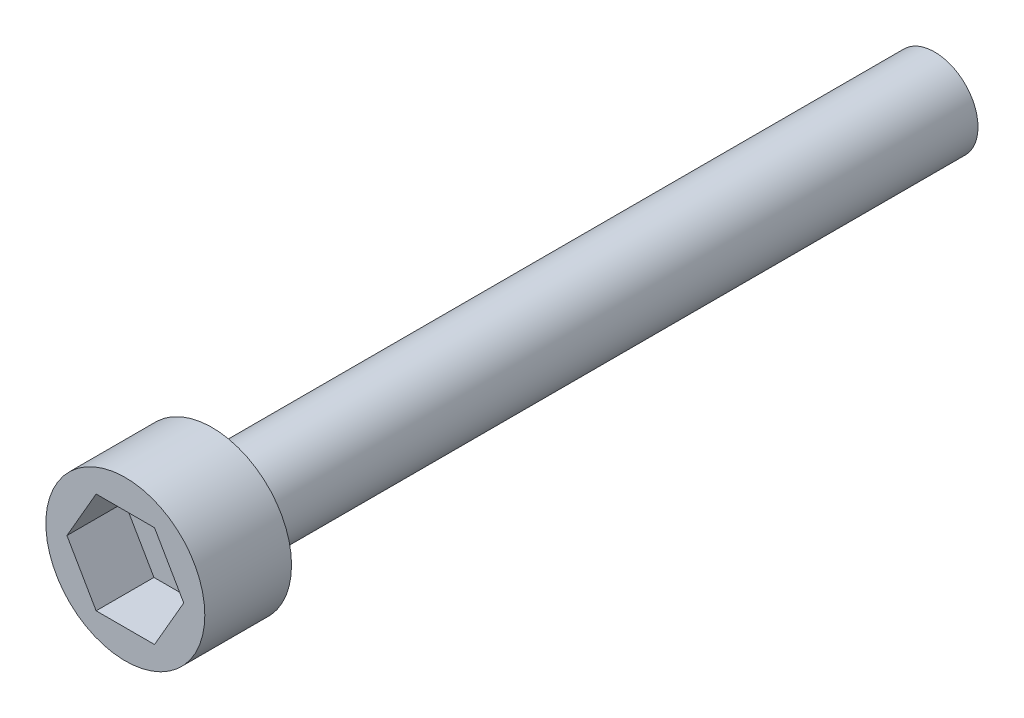
ISO-10303-21;
HEADER;
FILE_DESCRIPTION(('STEP AP214'),'2;1');
FILE_NAME('part.step','',(''),(''),'','','');
FILE_SCHEMA(('AUTOMOTIVE_DESIGN { 1 0 10303 214 1 1 1 1 }'));
ENDSEC;
DATA;
#1=APPLICATION_CONTEXT('core data for automotive mechanical design processes');
#2=APPLICATION_PROTOCOL_DEFINITION('international standard','automotive_design',2000,#1);
#3=PRODUCT_CONTEXT('',#1,'mechanical');
#4=PRODUCT('Part','Part','',(#3));
#5=PRODUCT_RELATED_PRODUCT_CATEGORY('part','',(#4));
#6=PRODUCT_DEFINITION_FORMATION('','',#4);
#7=PRODUCT_DEFINITION_CONTEXT('part definition',#1,'design');
#8=PRODUCT_DEFINITION('design','',#6,#7);
#9=PRODUCT_DEFINITION_SHAPE('','',#8);
#10=(LENGTH_UNIT() NAMED_UNIT(*) SI_UNIT(.MILLI.,.METRE.));
#11=(NAMED_UNIT(*) PLANE_ANGLE_UNIT() SI_UNIT($,.RADIAN.));
#12=(NAMED_UNIT(*) SI_UNIT($,.STERADIAN.) SOLID_ANGLE_UNIT());
#13=UNCERTAINTY_MEASURE_WITH_UNIT(LENGTH_MEASURE(1.E-05),#10,'distance_accuracy_value','');
#14=(GEOMETRIC_REPRESENTATION_CONTEXT(3) GLOBAL_UNCERTAINTY_ASSIGNED_CONTEXT((#13)) GLOBAL_UNIT_ASSIGNED_CONTEXT((#10,
#11,#12)) REPRESENTATION_CONTEXT('',''));
#15=CARTESIAN_POINT('',(0.,0.,0.));
#16=DIRECTION('',(0.,0.,1.));
#17=DIRECTION('',(1.,0.,0.));
#18=AXIS2_PLACEMENT_3D('',#15,#16,#17);
#19=CARTESIAN_POINT('',(0.,0.,25.));
#20=DIRECTION('',(0.,0.,-1.));
#21=DIRECTION('',(-1.,0.,0.));
#22=AXIS2_PLACEMENT_3D('',#19,#20,#21);
#23=CYLINDRICAL_SURFACE('',#22,1.5);
#24=CARTESIAN_POINT('',(0.,0.,25.));
#25=DIRECTION('',(0.,0.,1.));
#26=DIRECTION('',(1.,0.,0.));
#27=AXIS2_PLACEMENT_3D('',#24,#25,#26);
#28=CIRCLE('',#27,1.5);
#29=CARTESIAN_POINT('',(1.5,0.,25.));
#30=VERTEX_POINT('',#29);
#31=EDGE_CURVE('E11',#30,#30,#28,.T.);
#32=ORIENTED_EDGE('',*,*,#31,.F.);
#33=EDGE_LOOP('',(#32));
#34=FACE_BOUND('',#33,.T.);
#35=CARTESIAN_POINT('',(0.,0.,0.));
#36=DIRECTION('',(0.,0.,1.));
#37=DIRECTION('',(1.,0.,0.));
#38=AXIS2_PLACEMENT_3D('',#35,#36,#37);
#39=CIRCLE('',#38,1.5);
#40=CARTESIAN_POINT('',(1.5,0.,0.));
#41=VERTEX_POINT('',#40);
#42=EDGE_CURVE('E39',#41,#41,#39,.T.);
#43=ORIENTED_EDGE('',*,*,#42,.T.);
#44=EDGE_LOOP('',(#43));
#45=FACE_BOUND('',#44,.T.);
#46=ADVANCED_FACE('F36',(#34,#45),#23,.T.);
#47=CARTESIAN_POINT('',(0.,0.,0.));
#48=DIRECTION('',(0.,0.,1.));
#49=DIRECTION('',(1.,0.,0.));
#50=AXIS2_PLACEMENT_3D('',#47,#48,#49);
#51=PLANE('',#50);
#52=ORIENTED_EDGE('',*,*,#42,.F.);
#53=EDGE_LOOP('',(#52));
#54=FACE_BOUND('',#53,.T.);
#55=ADVANCED_FACE('F167',(#54),#51,.F.);
#56=CARTESIAN_POINT('',(0.,0.,28.));
#57=DIRECTION('',(0.,0.,-1.));
#58=DIRECTION('',(-1.,0.,0.));
#59=AXIS2_PLACEMENT_3D('',#56,#57,#58);
#60=CYLINDRICAL_SURFACE('',#59,2.75);
#61=CARTESIAN_POINT('',(0.,0.,28.));
#62=DIRECTION('',(0.,0.,1.));
#63=DIRECTION('',(1.,0.,0.));
#64=AXIS2_PLACEMENT_3D('',#61,#62,#63);
#65=CIRCLE('',#64,2.75);
#66=CARTESIAN_POINT('',(2.75,0.,28.));
#67=VERTEX_POINT('',#66);
#68=EDGE_CURVE('E143',#67,#67,#65,.T.);
#69=ORIENTED_EDGE('',*,*,#68,.F.);
#70=EDGE_LOOP('',(#69));
#71=FACE_BOUND('',#70,.T.);
#72=CARTESIAN_POINT('',(0.,0.,25.));
#73=DIRECTION('',(0.,0.,1.));
#74=DIRECTION('',(1.,0.,0.));
#75=AXIS2_PLACEMENT_3D('',#72,#73,#74);
#76=CIRCLE('',#75,2.75);
#77=CARTESIAN_POINT('',(2.75,0.,25.));
#78=VERTEX_POINT('',#77);
#79=EDGE_CURVE('E137',#78,#78,#76,.T.);
#80=ORIENTED_EDGE('',*,*,#79,.T.);
#81=EDGE_LOOP('',(#80));
#82=FACE_BOUND('',#81,.T.);
#83=ADVANCED_FACE('F149',(#71,#82),#60,.T.);
#84=CARTESIAN_POINT('',(0.,0.,28.));
#85=DIRECTION('',(0.,0.,1.));
#86=DIRECTION('',(1.,0.,0.));
#87=AXIS2_PLACEMENT_3D('',#84,#85,#86);
#88=PLANE('',#87);
#89=DIRECTION('',(0.5,0.866025403784439,0.));
#90=VECTOR('',#89,1.);
#91=CARTESIAN_POINT('',(1.01036297108185,-1.75,28.));
#92=LINE('',#91,#90);
#93=CARTESIAN_POINT('',(1.01036297108185,-1.75,28.));
#94=VERTEX_POINT('',#93);
#95=CARTESIAN_POINT('',(2.02072594216369,0.,28.));
#96=VERTEX_POINT('',#95);
#97=EDGE_CURVE('E50',#94,#96,#92,.T.);
#98=ORIENTED_EDGE('',*,*,#97,.F.);
#99=DIRECTION('',(1.,0.,0.));
#100=VECTOR('',#99,1.);
#101=CARTESIAN_POINT('',(-1.01036297108185,-1.75,28.));
#102=LINE('',#101,#100);
#103=CARTESIAN_POINT('',(-1.01036297108185,-1.75,28.));
#104=VERTEX_POINT('',#103);
#105=EDGE_CURVE('E133',#104,#94,#102,.T.);
#106=ORIENTED_EDGE('',*,*,#105,.F.);
#107=DIRECTION('',(0.5,-0.866025403784439,0.));
#108=VECTOR('',#107,1.);
#109=CARTESIAN_POINT('',(-2.02072594216369,0.,28.));
#110=LINE('',#109,#108);
#111=CARTESIAN_POINT('',(-2.02072594216369,0.,28.));
#112=VERTEX_POINT('',#111);
#113=EDGE_CURVE('E131',#112,#104,#110,.T.);
#114=ORIENTED_EDGE('',*,*,#113,.F.);
#115=DIRECTION('',(-0.5,-0.866025403784439,0.));
#116=VECTOR('',#115,1.);
#117=CARTESIAN_POINT('',(-1.01036297108185,1.75,28.));
#118=LINE('',#117,#116);
#119=CARTESIAN_POINT('',(-1.01036297108185,1.75,28.));
#120=VERTEX_POINT('',#119);
#121=EDGE_CURVE('E98',#120,#112,#118,.T.);
#122=ORIENTED_EDGE('',*,*,#121,.F.);
#123=DIRECTION('',(-1.,0.,0.));
#124=VECTOR('',#123,1.);
#125=CARTESIAN_POINT('',(1.01036297108184,1.75,28.));
#126=LINE('',#125,#124);
#127=CARTESIAN_POINT('',(1.01036297108184,1.75,28.));
#128=VERTEX_POINT('',#127);
#129=EDGE_CURVE('E127',#128,#120,#126,.T.);
#130=ORIENTED_EDGE('',*,*,#129,.F.);
#131=DIRECTION('',(-0.5,0.866025403784439,0.));
#132=VECTOR('',#131,1.);
#133=CARTESIAN_POINT('',(2.02072594216369,0.,28.));
#134=LINE('',#133,#132);
#135=EDGE_CURVE('E124',#96,#128,#134,.T.);
#136=ORIENTED_EDGE('',*,*,#135,.F.);
#137=EDGE_LOOP('',(#98,#106,#114,#122,#130,#136));
#138=FACE_BOUND('',#137,.T.);
#139=ORIENTED_EDGE('',*,*,#68,.T.);
#140=EDGE_LOOP('',(#139));
#141=FACE_BOUND('',#140,.T.);
#142=ADVANCED_FACE('F154',(#138,#141),#88,.T.);
#143=CARTESIAN_POINT('',(0.,0.,25.));
#144=DIRECTION('',(0.,0.,1.));
#145=DIRECTION('',(1.,0.,0.));
#146=AXIS2_PLACEMENT_3D('',#143,#144,#145);
#147=PLANE('',#146);
#148=ORIENTED_EDGE('',*,*,#31,.T.);
#149=EDGE_LOOP('',(#148));
#150=FACE_BOUND('',#149,.T.);
#151=ORIENTED_EDGE('',*,*,#79,.F.);
#152=EDGE_LOOP('',(#151));
#153=FACE_BOUND('',#152,.T.);
#154=ADVANCED_FACE('F151',(#150,#153),#147,.F.);
#155=CARTESIAN_POINT('',(1.01036297108185,-1.75,26.));
#156=DIRECTION('',(0.866025403784439,-0.5,0.));
#157=DIRECTION('',(0.5,0.866025403784439,0.));
#158=AXIS2_PLACEMENT_3D('',#155,#156,#157);
#159=PLANE('',#158);
#160=ORIENTED_EDGE('',*,*,#97,.T.);
#161=DIRECTION('',(0.,0.,1.));
#162=VECTOR('',#161,1.);
#163=CARTESIAN_POINT('',(2.02072594216369,0.,26.));
#164=LINE('',#163,#162);
#165=CARTESIAN_POINT('',(2.02072594216369,0.,26.));
#166=VERTEX_POINT('',#165);
#167=EDGE_CURVE('E80',#166,#96,#164,.T.);
#168=ORIENTED_EDGE('',*,*,#167,.F.);
#169=DIRECTION('',(0.5,0.866025403784439,0.));
#170=VECTOR('',#169,1.);
#171=CARTESIAN_POINT('',(1.01036297108185,-1.75,26.));
#172=LINE('',#171,#170);
#173=CARTESIAN_POINT('',(1.01036297108185,-1.75,26.));
#174=VERTEX_POINT('',#173);
#175=EDGE_CURVE('E135',#174,#166,#172,.T.);
#176=ORIENTED_EDGE('',*,*,#175,.F.);
#177=DIRECTION('',(0.,0.,1.));
#178=VECTOR('',#177,1.);
#179=CARTESIAN_POINT('',(1.01036297108185,-1.75,26.));
#180=LINE('',#179,#178);
#181=EDGE_CURVE('E58',#174,#94,#180,.T.);
#182=ORIENTED_EDGE('',*,*,#181,.T.);
#183=EDGE_LOOP('',(#160,#168,#176,#182));
#184=FACE_BOUND('',#183,.T.);
#185=ADVANCED_FACE('F153',(#184),#159,.F.);
#186=CARTESIAN_POINT('',(-1.01036297108185,-1.75,26.));
#187=DIRECTION('',(0.,-1.,0.));
#188=DIRECTION('',(1.,0.,0.));
#189=AXIS2_PLACEMENT_3D('',#186,#187,#188);
#190=PLANE('',#189);
#191=ORIENTED_EDGE('',*,*,#105,.T.);
#192=ORIENTED_EDGE('',*,*,#181,.F.);
#193=DIRECTION('',(1.,0.,0.));
#194=VECTOR('',#193,1.);
#195=CARTESIAN_POINT('',(-1.01036297108185,-1.75,26.));
#196=LINE('',#195,#194);
#197=CARTESIAN_POINT('',(-1.01036297108185,-1.75,26.));
#198=VERTEX_POINT('',#197);
#199=EDGE_CURVE('E110',#198,#174,#196,.T.);
#200=ORIENTED_EDGE('',*,*,#199,.F.);
#201=DIRECTION('',(0.,0.,1.));
#202=VECTOR('',#201,1.);
#203=CARTESIAN_POINT('',(-1.01036297108185,-1.75,26.));
#204=LINE('',#203,#202);
#205=EDGE_CURVE('E102',#198,#104,#204,.T.);
#206=ORIENTED_EDGE('',*,*,#205,.T.);
#207=EDGE_LOOP('',(#191,#192,#200,#206));
#208=FACE_BOUND('',#207,.T.);
#209=ADVANCED_FACE('F161',(#208),#190,.F.);
#210=CARTESIAN_POINT('',(-2.02072594216369,0.,26.));
#211=DIRECTION('',(-0.866025403784439,-0.5,0.));
#212=DIRECTION('',(0.5,-0.866025403784439,0.));
#213=AXIS2_PLACEMENT_3D('',#210,#211,#212);
#214=PLANE('',#213);
#215=ORIENTED_EDGE('',*,*,#113,.T.);
#216=ORIENTED_EDGE('',*,*,#205,.F.);
#217=DIRECTION('',(0.5,-0.866025403784439,0.));
#218=VECTOR('',#217,1.);
#219=CARTESIAN_POINT('',(-2.02072594216369,0.,26.));
#220=LINE('',#219,#218);
#221=CARTESIAN_POINT('',(-2.02072594216369,0.,26.));
#222=VERTEX_POINT('',#221);
#223=EDGE_CURVE('E106',#222,#198,#220,.T.);
#224=ORIENTED_EDGE('',*,*,#223,.F.);
#225=DIRECTION('',(0.,0.,1.));
#226=VECTOR('',#225,1.);
#227=CARTESIAN_POINT('',(-2.02072594216369,0.,26.));
#228=LINE('',#227,#226);
#229=EDGE_CURVE('E91',#222,#112,#228,.T.);
#230=ORIENTED_EDGE('',*,*,#229,.T.);
#231=EDGE_LOOP('',(#215,#216,#224,#230));
#232=FACE_BOUND('',#231,.T.);
#233=ADVANCED_FACE('F107',(#232),#214,.F.);
#234=CARTESIAN_POINT('',(-1.01036297108185,1.75,26.));
#235=DIRECTION('',(-0.866025403784439,0.5,0.));
#236=DIRECTION('',(-0.5,-0.866025403784439,0.));
#237=AXIS2_PLACEMENT_3D('',#234,#235,#236);
#238=PLANE('',#237);
#239=ORIENTED_EDGE('',*,*,#121,.T.);
#240=ORIENTED_EDGE('',*,*,#229,.F.);
#241=DIRECTION('',(-0.5,-0.866025403784439,0.));
#242=VECTOR('',#241,1.);
#243=CARTESIAN_POINT('',(-1.01036297108185,1.75,26.));
#244=LINE('',#243,#242);
#245=CARTESIAN_POINT('',(-1.01036297108185,1.75,26.));
#246=VERTEX_POINT('',#245);
#247=EDGE_CURVE('E95',#246,#222,#244,.T.);
#248=ORIENTED_EDGE('',*,*,#247,.F.);
#249=DIRECTION('',(0.,0.,1.));
#250=VECTOR('',#249,1.);
#251=CARTESIAN_POINT('',(-1.01036297108185,1.75,26.));
#252=LINE('',#251,#250);
#253=EDGE_CURVE('E103',#246,#120,#252,.T.);
#254=ORIENTED_EDGE('',*,*,#253,.T.);
#255=EDGE_LOOP('',(#239,#240,#248,#254));
#256=FACE_BOUND('',#255,.T.);
#257=ADVANCED_FACE('F93',(#256),#238,.F.);
#258=CARTESIAN_POINT('',(1.01036297108184,1.75,26.));
#259=DIRECTION('',(0.,1.,0.));
#260=DIRECTION('',(-1.,0.,0.));
#261=AXIS2_PLACEMENT_3D('',#258,#259,#260);
#262=PLANE('',#261);
#263=ORIENTED_EDGE('',*,*,#129,.T.);
#264=ORIENTED_EDGE('',*,*,#253,.F.);
#265=DIRECTION('',(-1.,0.,0.));
#266=VECTOR('',#265,1.);
#267=CARTESIAN_POINT('',(1.01036297108184,1.75,26.));
#268=LINE('',#267,#266);
#269=CARTESIAN_POINT('',(1.01036297108184,1.75,26.));
#270=VERTEX_POINT('',#269);
#271=EDGE_CURVE('E116',#270,#246,#268,.T.);
#272=ORIENTED_EDGE('',*,*,#271,.F.);
#273=DIRECTION('',(0.,0.,1.));
#274=VECTOR('',#273,1.);
#275=CARTESIAN_POINT('',(1.01036297108184,1.75,26.));
#276=LINE('',#275,#274);
#277=EDGE_CURVE('E140',#270,#128,#276,.T.);
#278=ORIENTED_EDGE('',*,*,#277,.T.);
#279=EDGE_LOOP('',(#263,#264,#272,#278));
#280=FACE_BOUND('',#279,.T.);
#281=ADVANCED_FACE('F222',(#280),#262,.F.);
#282=CARTESIAN_POINT('',(2.02072594216369,0.,26.));
#283=DIRECTION('',(0.866025403784439,0.5,0.));
#284=DIRECTION('',(-0.5,0.866025403784439,0.));
#285=AXIS2_PLACEMENT_3D('',#282,#283,#284);
#286=PLANE('',#285);
#287=ORIENTED_EDGE('',*,*,#135,.T.);
#288=ORIENTED_EDGE('',*,*,#277,.F.);
#289=DIRECTION('',(-0.5,0.866025403784439,0.));
#290=VECTOR('',#289,1.);
#291=CARTESIAN_POINT('',(2.02072594216369,0.,26.));
#292=LINE('',#291,#290);
#293=EDGE_CURVE('E118',#166,#270,#292,.T.);
#294=ORIENTED_EDGE('',*,*,#293,.F.);
#295=ORIENTED_EDGE('',*,*,#167,.T.);
#296=EDGE_LOOP('',(#287,#288,#294,#295));
#297=FACE_BOUND('',#296,.T.);
#298=ADVANCED_FACE('F231',(#297),#286,.F.);
#299=CARTESIAN_POINT('',(0.,0.,26.));
#300=DIRECTION('',(0.,0.,1.));
#301=DIRECTION('',(1.,0.,0.));
#302=AXIS2_PLACEMENT_3D('',#299,#300,#301);
#303=PLANE('',#302);
#304=ORIENTED_EDGE('',*,*,#175,.T.);
#305=ORIENTED_EDGE('',*,*,#293,.T.);
#306=ORIENTED_EDGE('',*,*,#271,.T.);
#307=ORIENTED_EDGE('',*,*,#247,.T.);
#308=ORIENTED_EDGE('',*,*,#223,.T.);
#309=ORIENTED_EDGE('',*,*,#199,.T.);
#310=EDGE_LOOP('',(#304,#305,#306,#307,#308,#309));
#311=FACE_BOUND('',#310,.T.);
#312=ADVANCED_FACE('F113',(#311),#303,.T.);
#313=CLOSED_SHELL('',(#46,#55,#83,#142,#154,#185,#209,#233,#257,#281,#298,#312));
#314=MANIFOLD_SOLID_BREP('B2',#313);
#315=ADVANCED_BREP_SHAPE_REPRESENTATION('',(#18,#314),#14);
#316=SHAPE_DEFINITION_REPRESENTATION(#9,#315);
ENDSEC;
END-ISO-10303-21;
